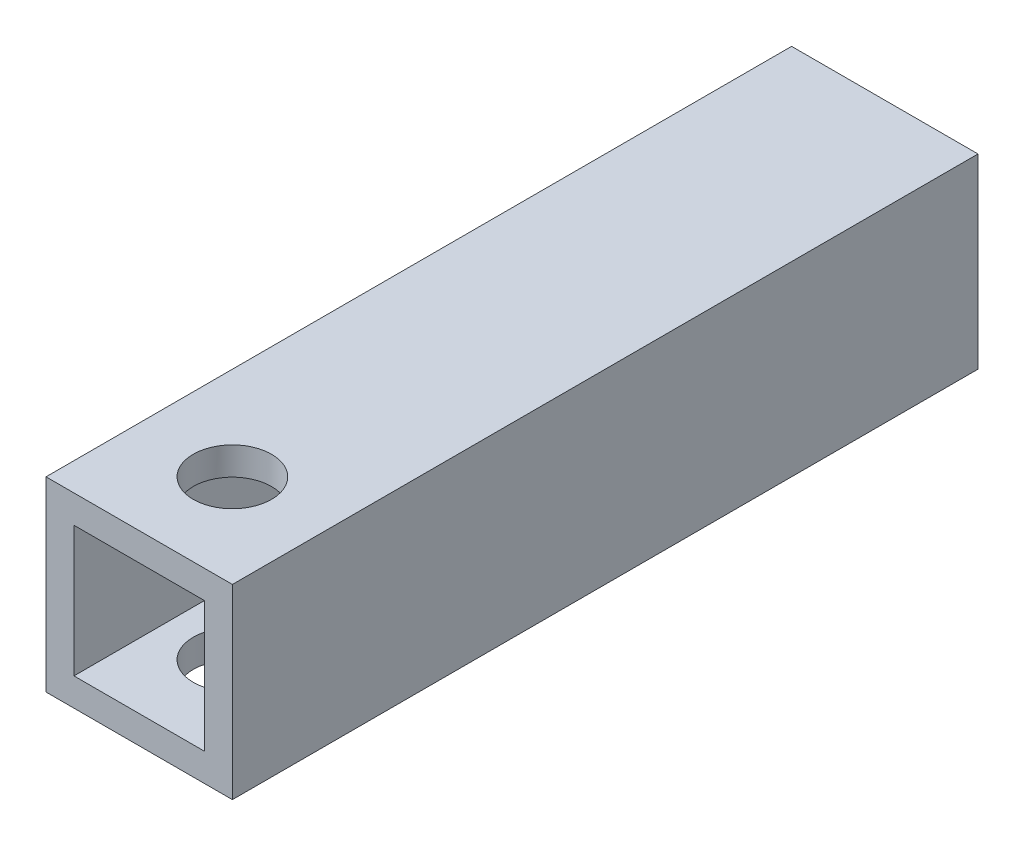
ISO-10303-21;
HEADER;
FILE_DESCRIPTION(('STEP AP214'),'2;1');
FILE_NAME('part.step','',(''),(''),'','','');
FILE_SCHEMA(('AUTOMOTIVE_DESIGN { 1 0 10303 214 1 1 1 1 }'));
ENDSEC;
DATA;
#1=APPLICATION_CONTEXT('core data for automotive mechanical design processes');
#2=APPLICATION_PROTOCOL_DEFINITION('international standard','automotive_design',2000,#1);
#3=PRODUCT_CONTEXT('',#1,'mechanical');
#4=PRODUCT('Part','Part','',(#3));
#5=PRODUCT_RELATED_PRODUCT_CATEGORY('part','',(#4));
#6=PRODUCT_DEFINITION_FORMATION('','',#4);
#7=PRODUCT_DEFINITION_CONTEXT('part definition',#1,'design');
#8=PRODUCT_DEFINITION('design','',#6,#7);
#9=PRODUCT_DEFINITION_SHAPE('','',#8);
#10=(LENGTH_UNIT() NAMED_UNIT(*) SI_UNIT(.MILLI.,.METRE.));
#11=(NAMED_UNIT(*) PLANE_ANGLE_UNIT() SI_UNIT($,.RADIAN.));
#12=(NAMED_UNIT(*) SI_UNIT($,.STERADIAN.) SOLID_ANGLE_UNIT());
#13=UNCERTAINTY_MEASURE_WITH_UNIT(LENGTH_MEASURE(1.E-05),#10,'distance_accuracy_value','');
#14=(GEOMETRIC_REPRESENTATION_CONTEXT(3) GLOBAL_UNCERTAINTY_ASSIGNED_CONTEXT((#13)) GLOBAL_UNIT_ASSIGNED_CONTEXT((#10,
#11,#12)) REPRESENTATION_CONTEXT('',''));
#15=CARTESIAN_POINT('',(0.,0.,0.));
#16=DIRECTION('',(0.,0.,1.));
#17=DIRECTION('',(1.,0.,0.));
#18=AXIS2_PLACEMENT_3D('',#15,#16,#17);
#19=CARTESIAN_POINT('',(-5.,5.,40.));
#20=DIRECTION('',(0.,-1.,0.));
#21=DIRECTION('',(0.,0.,-1.));
#22=AXIS2_PLACEMENT_3D('',#19,#20,#21);
#23=PLANE('',#22);
#24=DIRECTION('',(-1.,0.,0.));
#25=VECTOR('',#24,1.);
#26=CARTESIAN_POINT('',(-5.,5.,0.));
#27=LINE('',#26,#25);
#28=CARTESIAN_POINT('',(5.,5.,0.));
#29=VERTEX_POINT('',#28);
#30=CARTESIAN_POINT('',(-5.,5.,0.));
#31=VERTEX_POINT('',#30);
#32=EDGE_CURVE('E174',#29,#31,#27,.T.);
#33=ORIENTED_EDGE('',*,*,#32,.T.);
#34=DIRECTION('',(0.,0.,-1.));
#35=VECTOR('',#34,1.);
#36=CARTESIAN_POINT('',(-5.,5.,40.));
#37=LINE('',#36,#35);
#38=CARTESIAN_POINT('',(-5.,5.,40.));
#39=VERTEX_POINT('',#38);
#40=EDGE_CURVE('E65',#39,#31,#37,.T.);
#41=ORIENTED_EDGE('',*,*,#40,.F.);
#42=DIRECTION('',(-1.,0.,0.));
#43=VECTOR('',#42,1.);
#44=CARTESIAN_POINT('',(-5.,5.,40.));
#45=LINE('',#44,#43);
#46=CARTESIAN_POINT('',(5.,5.,40.));
#47=VERTEX_POINT('',#46);
#48=EDGE_CURVE('E164',#47,#39,#45,.T.);
#49=ORIENTED_EDGE('',*,*,#48,.F.);
#50=DIRECTION('',(0.,0.,-1.));
#51=VECTOR('',#50,1.);
#52=CARTESIAN_POINT('',(5.,5.,40.));
#53=LINE('',#52,#51);
#54=EDGE_CURVE('E12',#47,#29,#53,.T.);
#55=ORIENTED_EDGE('',*,*,#54,.T.);
#56=EDGE_LOOP('',(#33,#41,#49,#55));
#57=FACE_BOUND('',#56,.T.);
#58=CARTESIAN_POINT('',(0.,5.,35.));
#59=DIRECTION('',(0.,1.,0.));
#60=DIRECTION('',(0.,0.,1.));
#61=AXIS2_PLACEMENT_3D('',#58,#59,#60);
#62=CIRCLE('',#61,2.09999999999999);
#63=CARTESIAN_POINT('',(0.,5.,37.1));
#64=VERTEX_POINT('',#63);
#65=EDGE_CURVE('E209',#64,#64,#62,.T.);
#66=ORIENTED_EDGE('',*,*,#65,.F.);
#67=EDGE_LOOP('',(#66));
#68=FACE_BOUND('',#67,.T.);
#69=ADVANCED_FACE('F56',(#57,#68),#23,.F.);
#70=CARTESIAN_POINT('',(0.,0.,40.));
#71=DIRECTION('',(0.,0.,1.));
#72=DIRECTION('',(1.,0.,0.));
#73=AXIS2_PLACEMENT_3D('',#70,#71,#72);
#74=PLANE('',#73);
#75=DIRECTION('',(0.,1.,0.));
#76=VECTOR('',#75,1.);
#77=CARTESIAN_POINT('',(5.,-5.,40.));
#78=LINE('',#77,#76);
#79=CARTESIAN_POINT('',(5.,-5.,40.));
#80=VERTEX_POINT('',#79);
#81=EDGE_CURVE('E161',#80,#47,#78,.T.);
#82=ORIENTED_EDGE('',*,*,#81,.T.);
#83=ORIENTED_EDGE('',*,*,#48,.T.);
#84=DIRECTION('',(0.,-1.,0.));
#85=VECTOR('',#84,1.);
#86=CARTESIAN_POINT('',(-5.,-5.,40.));
#87=LINE('',#86,#85);
#88=CARTESIAN_POINT('',(-5.,-5.,40.));
#89=VERTEX_POINT('',#88);
#90=EDGE_CURVE('E167',#39,#89,#87,.T.);
#91=ORIENTED_EDGE('',*,*,#90,.T.);
#92=DIRECTION('',(1.,0.,0.));
#93=VECTOR('',#92,1.);
#94=CARTESIAN_POINT('',(-5.,-5.,40.));
#95=LINE('',#94,#93);
#96=EDGE_CURVE('E169',#89,#80,#95,.T.);
#97=ORIENTED_EDGE('',*,*,#96,.T.);
#98=EDGE_LOOP('',(#82,#83,#91,#97));
#99=FACE_BOUND('',#98,.T.);
#100=DIRECTION('',(-1.,0.,0.));
#101=VECTOR('',#100,1.);
#102=CARTESIAN_POINT('',(0.,3.5,40.));
#103=LINE('',#102,#101);
#104=CARTESIAN_POINT('',(3.5,3.5,40.));
#105=VERTEX_POINT('',#104);
#106=CARTESIAN_POINT('',(-3.5,3.5,40.));
#107=VERTEX_POINT('',#106);
#108=EDGE_CURVE('E130',#105,#107,#103,.T.);
#109=ORIENTED_EDGE('',*,*,#108,.F.);
#110=DIRECTION('',(0.,1.,0.));
#111=VECTOR('',#110,1.);
#112=CARTESIAN_POINT('',(3.5,0.,40.));
#113=LINE('',#112,#111);
#114=CARTESIAN_POINT('',(3.5,-3.5,40.));
#115=VERTEX_POINT('',#114);
#116=EDGE_CURVE('E122',#115,#105,#113,.T.);
#117=ORIENTED_EDGE('',*,*,#116,.F.);
#118=DIRECTION('',(1.,0.,0.));
#119=VECTOR('',#118,1.);
#120=CARTESIAN_POINT('',(0.,-3.5,40.));
#121=LINE('',#120,#119);
#122=CARTESIAN_POINT('',(-3.5,-3.5,40.));
#123=VERTEX_POINT('',#122);
#124=EDGE_CURVE('E145',#123,#115,#121,.T.);
#125=ORIENTED_EDGE('',*,*,#124,.F.);
#126=DIRECTION('',(0.,-1.,0.));
#127=VECTOR('',#126,1.);
#128=CARTESIAN_POINT('',(-3.5,0.,40.));
#129=LINE('',#128,#127);
#130=EDGE_CURVE('E143',#107,#123,#129,.T.);
#131=ORIENTED_EDGE('',*,*,#130,.F.);
#132=EDGE_LOOP('',(#109,#117,#125,#131));
#133=FACE_BOUND('',#132,.T.);
#134=ADVANCED_FACE('F142',(#99,#133),#74,.T.);
#135=CARTESIAN_POINT('',(0.,0.,0.));
#136=DIRECTION('',(0.,0.,1.));
#137=DIRECTION('',(1.,0.,0.));
#138=AXIS2_PLACEMENT_3D('',#135,#136,#137);
#139=PLANE('',#138);
#140=DIRECTION('',(0.,1.,0.));
#141=VECTOR('',#140,1.);
#142=CARTESIAN_POINT('',(5.,-5.,0.));
#143=LINE('',#142,#141);
#144=CARTESIAN_POINT('',(5.,-5.,0.));
#145=VERTEX_POINT('',#144);
#146=EDGE_CURVE('E138',#145,#29,#143,.T.);
#147=ORIENTED_EDGE('',*,*,#146,.F.);
#148=DIRECTION('',(1.,0.,0.));
#149=VECTOR('',#148,1.);
#150=CARTESIAN_POINT('',(-5.,-5.,0.));
#151=LINE('',#150,#149);
#152=CARTESIAN_POINT('',(-5.,-5.,0.));
#153=VERTEX_POINT('',#152);
#154=EDGE_CURVE('E165',#153,#145,#151,.T.);
#155=ORIENTED_EDGE('',*,*,#154,.F.);
#156=DIRECTION('',(0.,-1.,0.));
#157=VECTOR('',#156,1.);
#158=CARTESIAN_POINT('',(-5.,-5.,0.));
#159=LINE('',#158,#157);
#160=EDGE_CURVE('E176',#31,#153,#159,.T.);
#161=ORIENTED_EDGE('',*,*,#160,.F.);
#162=ORIENTED_EDGE('',*,*,#32,.F.);
#163=EDGE_LOOP('',(#147,#155,#161,#162));
#164=FACE_BOUND('',#163,.T.);
#165=DIRECTION('',(0.,1.,0.));
#166=VECTOR('',#165,1.);
#167=CARTESIAN_POINT('',(3.5,0.,0.));
#168=LINE('',#167,#166);
#169=CARTESIAN_POINT('',(3.5,-3.5,0.));
#170=VERTEX_POINT('',#169);
#171=CARTESIAN_POINT('',(3.5,3.5,0.));
#172=VERTEX_POINT('',#171);
#173=EDGE_CURVE('E80',#170,#172,#168,.T.);
#174=ORIENTED_EDGE('',*,*,#173,.T.);
#175=DIRECTION('',(-1.,0.,0.));
#176=VECTOR('',#175,1.);
#177=CARTESIAN_POINT('',(0.,3.5,0.));
#178=LINE('',#177,#176);
#179=CARTESIAN_POINT('',(-3.5,3.5,0.));
#180=VERTEX_POINT('',#179);
#181=EDGE_CURVE('E137',#172,#180,#178,.T.);
#182=ORIENTED_EDGE('',*,*,#181,.T.);
#183=DIRECTION('',(0.,-1.,0.));
#184=VECTOR('',#183,1.);
#185=CARTESIAN_POINT('',(-3.5,0.,0.));
#186=LINE('',#185,#184);
#187=CARTESIAN_POINT('',(-3.5,-3.5,0.));
#188=VERTEX_POINT('',#187);
#189=EDGE_CURVE('E153',#180,#188,#186,.T.);
#190=ORIENTED_EDGE('',*,*,#189,.T.);
#191=DIRECTION('',(1.,0.,0.));
#192=VECTOR('',#191,1.);
#193=CARTESIAN_POINT('',(0.,-3.5,0.));
#194=LINE('',#193,#192);
#195=EDGE_CURVE('E131',#188,#170,#194,.T.);
#196=ORIENTED_EDGE('',*,*,#195,.T.);
#197=EDGE_LOOP('',(#174,#182,#190,#196));
#198=FACE_BOUND('',#197,.T.);
#199=ADVANCED_FACE('F195',(#164,#198),#139,.F.);
#200=CARTESIAN_POINT('',(5.,-5.,40.));
#201=DIRECTION('',(-1.,0.,0.));
#202=DIRECTION('',(0.,0.,1.));
#203=AXIS2_PLACEMENT_3D('',#200,#201,#202);
#204=PLANE('',#203);
#205=ORIENTED_EDGE('',*,*,#146,.T.);
#206=ORIENTED_EDGE('',*,*,#54,.F.);
#207=ORIENTED_EDGE('',*,*,#81,.F.);
#208=DIRECTION('',(0.,0.,-1.));
#209=VECTOR('',#208,1.);
#210=CARTESIAN_POINT('',(5.,-5.,40.));
#211=LINE('',#210,#209);
#212=EDGE_CURVE('E171',#80,#145,#211,.T.);
#213=ORIENTED_EDGE('',*,*,#212,.T.);
#214=EDGE_LOOP('',(#205,#206,#207,#213));
#215=FACE_BOUND('',#214,.T.);
#216=ADVANCED_FACE('F58',(#215),#204,.F.);
#217=CARTESIAN_POINT('',(-5.,-5.,40.));
#218=DIRECTION('',(1.,0.,0.));
#219=DIRECTION('',(0.,0.,-1.));
#220=AXIS2_PLACEMENT_3D('',#217,#218,#219);
#221=PLANE('',#220);
#222=ORIENTED_EDGE('',*,*,#160,.T.);
#223=DIRECTION('',(0.,0.,-1.));
#224=VECTOR('',#223,1.);
#225=CARTESIAN_POINT('',(-5.,-5.,40.));
#226=LINE('',#225,#224);
#227=EDGE_CURVE('E181',#89,#153,#226,.T.);
#228=ORIENTED_EDGE('',*,*,#227,.F.);
#229=ORIENTED_EDGE('',*,*,#90,.F.);
#230=ORIENTED_EDGE('',*,*,#40,.T.);
#231=EDGE_LOOP('',(#222,#228,#229,#230));
#232=FACE_BOUND('',#231,.T.);
#233=ADVANCED_FACE('F189',(#232),#221,.F.);
#234=CARTESIAN_POINT('',(-5.,-5.,40.));
#235=DIRECTION('',(0.,1.,0.));
#236=DIRECTION('',(0.,0.,1.));
#237=AXIS2_PLACEMENT_3D('',#234,#235,#236);
#238=PLANE('',#237);
#239=CARTESIAN_POINT('',(0.,-5.,35.));
#240=DIRECTION('',(0.,1.,0.));
#241=DIRECTION('',(0.,0.,1.));
#242=AXIS2_PLACEMENT_3D('',#239,#240,#241);
#243=CIRCLE('',#242,2.1);
#244=CARTESIAN_POINT('',(0.,-5.,37.1));
#245=VERTEX_POINT('',#244);
#246=EDGE_CURVE('E211',#245,#245,#243,.T.);
#247=ORIENTED_EDGE('',*,*,#246,.T.);
#248=EDGE_LOOP('',(#247));
#249=FACE_BOUND('',#248,.T.);
#250=ORIENTED_EDGE('',*,*,#154,.T.);
#251=ORIENTED_EDGE('',*,*,#212,.F.);
#252=ORIENTED_EDGE('',*,*,#96,.F.);
#253=ORIENTED_EDGE('',*,*,#227,.T.);
#254=EDGE_LOOP('',(#250,#251,#252,#253));
#255=FACE_BOUND('',#254,.T.);
#256=ADVANCED_FACE('F199',(#249,#255),#238,.F.);
#257=CARTESIAN_POINT('',(3.5,0.,40.));
#258=DIRECTION('',(-1.,0.,0.));
#259=DIRECTION('',(0.,0.,1.));
#260=AXIS2_PLACEMENT_3D('',#257,#258,#259);
#261=PLANE('',#260);
#262=ORIENTED_EDGE('',*,*,#173,.F.);
#263=DIRECTION('',(0.,0.,-1.));
#264=VECTOR('',#263,1.);
#265=CARTESIAN_POINT('',(3.5,-3.5,40.));
#266=LINE('',#265,#264);
#267=EDGE_CURVE('E126',#115,#170,#266,.T.);
#268=ORIENTED_EDGE('',*,*,#267,.F.);
#269=ORIENTED_EDGE('',*,*,#116,.T.);
#270=DIRECTION('',(0.,0.,-1.));
#271=VECTOR('',#270,1.);
#272=CARTESIAN_POINT('',(3.5,3.5,40.));
#273=LINE('',#272,#271);
#274=EDGE_CURVE('E125',#105,#172,#273,.T.);
#275=ORIENTED_EDGE('',*,*,#274,.T.);
#276=EDGE_LOOP('',(#262,#268,#269,#275));
#277=FACE_BOUND('',#276,.T.);
#278=ADVANCED_FACE('F124',(#277),#261,.T.);
#279=CARTESIAN_POINT('',(0.,3.5,40.));
#280=DIRECTION('',(0.,-1.,0.));
#281=DIRECTION('',(0.,0.,-1.));
#282=AXIS2_PLACEMENT_3D('',#279,#280,#281);
#283=PLANE('',#282);
#284=CARTESIAN_POINT('',(0.,3.5,35.));
#285=DIRECTION('',(0.,-1.,0.));
#286=DIRECTION('',(0.,0.,-1.));
#287=AXIS2_PLACEMENT_3D('',#284,#285,#286);
#288=CIRCLE('',#287,2.09999999999999);
#289=CARTESIAN_POINT('',(0.,3.5,32.9));
#290=VERTEX_POINT('',#289);
#291=EDGE_CURVE('E151',#290,#290,#288,.T.);
#292=ORIENTED_EDGE('',*,*,#291,.F.);
#293=EDGE_LOOP('',(#292));
#294=FACE_BOUND('',#293,.T.);
#295=ORIENTED_EDGE('',*,*,#181,.F.);
#296=ORIENTED_EDGE('',*,*,#274,.F.);
#297=ORIENTED_EDGE('',*,*,#108,.T.);
#298=DIRECTION('',(0.,0.,-1.));
#299=VECTOR('',#298,1.);
#300=CARTESIAN_POINT('',(-3.5,3.5,40.));
#301=LINE('',#300,#299);
#302=EDGE_CURVE('E139',#107,#180,#301,.T.);
#303=ORIENTED_EDGE('',*,*,#302,.T.);
#304=EDGE_LOOP('',(#295,#296,#297,#303));
#305=FACE_BOUND('',#304,.T.);
#306=ADVANCED_FACE('F134',(#294,#305),#283,.T.);
#307=CARTESIAN_POINT('',(-3.5,0.,40.));
#308=DIRECTION('',(1.,0.,0.));
#309=DIRECTION('',(0.,0.,-1.));
#310=AXIS2_PLACEMENT_3D('',#307,#308,#309);
#311=PLANE('',#310);
#312=ORIENTED_EDGE('',*,*,#189,.F.);
#313=ORIENTED_EDGE('',*,*,#302,.F.);
#314=ORIENTED_EDGE('',*,*,#130,.T.);
#315=DIRECTION('',(0.,0.,-1.));
#316=VECTOR('',#315,1.);
#317=CARTESIAN_POINT('',(-3.5,-3.5,40.));
#318=LINE('',#317,#316);
#319=EDGE_CURVE('E72',#123,#188,#318,.T.);
#320=ORIENTED_EDGE('',*,*,#319,.T.);
#321=EDGE_LOOP('',(#312,#313,#314,#320));
#322=FACE_BOUND('',#321,.T.);
#323=ADVANCED_FACE('F226',(#322),#311,.T.);
#324=CARTESIAN_POINT('',(0.,-3.5,40.));
#325=DIRECTION('',(0.,1.,0.));
#326=DIRECTION('',(0.,0.,1.));
#327=AXIS2_PLACEMENT_3D('',#324,#325,#326);
#328=PLANE('',#327);
#329=CARTESIAN_POINT('',(0.,-3.5,35.));
#330=DIRECTION('',(0.,1.,0.));
#331=DIRECTION('',(0.,0.,1.));
#332=AXIS2_PLACEMENT_3D('',#329,#330,#331);
#333=CIRCLE('',#332,2.09999999999999);
#334=CARTESIAN_POINT('',(0.,-3.5,37.1));
#335=VERTEX_POINT('',#334);
#336=EDGE_CURVE('E60',#335,#335,#333,.T.);
#337=ORIENTED_EDGE('',*,*,#336,.F.);
#338=EDGE_LOOP('',(#337));
#339=FACE_BOUND('',#338,.T.);
#340=ORIENTED_EDGE('',*,*,#195,.F.);
#341=ORIENTED_EDGE('',*,*,#319,.F.);
#342=ORIENTED_EDGE('',*,*,#124,.T.);
#343=ORIENTED_EDGE('',*,*,#267,.T.);
#344=EDGE_LOOP('',(#340,#341,#342,#343));
#345=FACE_BOUND('',#344,.T.);
#346=ADVANCED_FACE('F224',(#339,#345),#328,.T.);
#347=CARTESIAN_POINT('',(0.,5.,35.));
#348=DIRECTION('',(0.,1.,0.));
#349=DIRECTION('',(0.,0.,1.));
#350=AXIS2_PLACEMENT_3D('',#347,#348,#349);
#351=CYLINDRICAL_SURFACE('',#350,2.09999999999999);
#352=ORIENTED_EDGE('',*,*,#336,.T.);
#353=EDGE_LOOP('',(#352));
#354=FACE_BOUND('',#353,.T.);
#355=ORIENTED_EDGE('',*,*,#246,.F.);
#356=EDGE_LOOP('',(#355));
#357=FACE_BOUND('',#356,.T.);
#358=ADVANCED_FACE('F221',(#354,#357),#351,.F.);
#359=ORIENTED_EDGE('',*,*,#291,.T.);
#360=EDGE_LOOP('',(#359));
#361=FACE_BOUND('',#360,.T.);
#362=ORIENTED_EDGE('',*,*,#65,.T.);
#363=EDGE_LOOP('',(#362));
#364=FACE_BOUND('',#363,.T.);
#365=ADVANCED_FACE('F298',(#361,#364),#351,.F.);
#366=CLOSED_SHELL('',(#69,#134,#199,#216,#233,#256,#278,#306,#323,#346,#358,#365));
#367=MANIFOLD_SOLID_BREP('B2',#366);
#368=ADVANCED_BREP_SHAPE_REPRESENTATION('',(#18,#367),#14);
#369=SHAPE_DEFINITION_REPRESENTATION(#9,#368);
ENDSEC;
END-ISO-10303-21;
